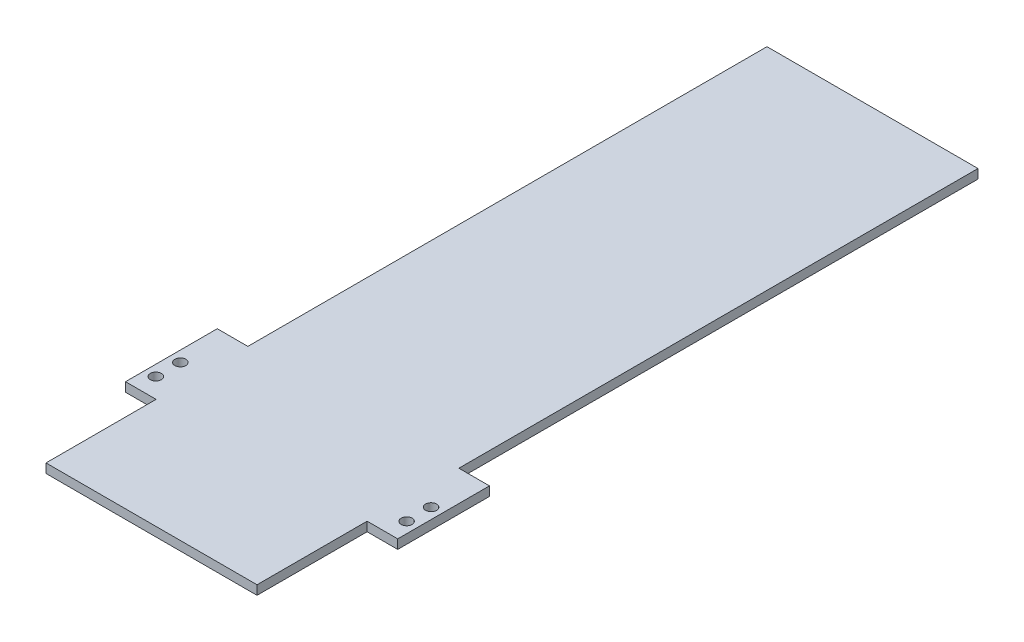
ISO-10303-21;
HEADER;
FILE_DESCRIPTION(('STEP AP214'),'2;1');
FILE_NAME('part.step','',(''),(''),'','','');
FILE_SCHEMA(('AUTOMOTIVE_DESIGN { 1 0 10303 214 1 1 1 1 }'));
ENDSEC;
DATA;
#1=APPLICATION_CONTEXT('core data for automotive mechanical design processes');
#2=APPLICATION_PROTOCOL_DEFINITION('international standard','automotive_design',2000,#1);
#3=PRODUCT_CONTEXT('',#1,'mechanical');
#4=PRODUCT('Part','Part','',(#3));
#5=PRODUCT_RELATED_PRODUCT_CATEGORY('part','',(#4));
#6=PRODUCT_DEFINITION_FORMATION('','',#4);
#7=PRODUCT_DEFINITION_CONTEXT('part definition',#1,'design');
#8=PRODUCT_DEFINITION('design','',#6,#7);
#9=PRODUCT_DEFINITION_SHAPE('','',#8);
#10=(LENGTH_UNIT() NAMED_UNIT(*) SI_UNIT(.MILLI.,.METRE.));
#11=(NAMED_UNIT(*) PLANE_ANGLE_UNIT() SI_UNIT($,.RADIAN.));
#12=(NAMED_UNIT(*) SI_UNIT($,.STERADIAN.) SOLID_ANGLE_UNIT());
#13=UNCERTAINTY_MEASURE_WITH_UNIT(LENGTH_MEASURE(1.E-05),#10,'distance_accuracy_value','');
#14=(GEOMETRIC_REPRESENTATION_CONTEXT(3) GLOBAL_UNCERTAINTY_ASSIGNED_CONTEXT((#13)) GLOBAL_UNIT_ASSIGNED_CONTEXT((#10,
#11,#12)) REPRESENTATION_CONTEXT('',''));
#15=CARTESIAN_POINT('',(0.,0.,0.));
#16=DIRECTION('',(0.,0.,1.));
#17=DIRECTION('',(1.,0.,0.));
#18=AXIS2_PLACEMENT_3D('',#15,#16,#17);
#19=CARTESIAN_POINT('',(0.,3.,-36.));
#20=DIRECTION('',(0.,0.,1.));
#21=DIRECTION('',(1.,0.,0.));
#22=AXIS2_PLACEMENT_3D('',#19,#20,#21);
#23=PLANE('',#22);
#24=DIRECTION('',(-1.,0.,0.));
#25=VECTOR('',#24,1.);
#26=CARTESIAN_POINT('',(0.,0.,-36.));
#27=LINE('',#26,#25);
#28=CARTESIAN_POINT('',(0.,0.,-36.));
#29=VERTEX_POINT('',#28);
#30=CARTESIAN_POINT('',(-9.99999999999999,0.,-36.));
#31=VERTEX_POINT('',#30);
#32=EDGE_CURVE('E170',#29,#31,#27,.T.);
#33=ORIENTED_EDGE('',*,*,#32,.F.);
#34=DIRECTION('',(0.,-1.,0.));
#35=VECTOR('',#34,1.);
#36=CARTESIAN_POINT('',(0.,3.,-36.));
#37=LINE('',#36,#35);
#38=CARTESIAN_POINT('',(0.,3.,-36.));
#39=VERTEX_POINT('',#38);
#40=EDGE_CURVE('E11',#39,#29,#37,.T.);
#41=ORIENTED_EDGE('',*,*,#40,.F.);
#42=DIRECTION('',(-1.,0.,0.));
#43=VECTOR('',#42,1.);
#44=CARTESIAN_POINT('',(0.,3.,-36.));
#45=LINE('',#44,#43);
#46=CARTESIAN_POINT('',(-9.99999999999999,3.,-36.));
#47=VERTEX_POINT('',#46);
#48=EDGE_CURVE('E205',#39,#47,#45,.T.);
#49=ORIENTED_EDGE('',*,*,#48,.T.);
#50=DIRECTION('',(0.,-1.,0.));
#51=VECTOR('',#50,1.);
#52=CARTESIAN_POINT('',(-9.99999999999999,3.,-36.));
#53=LINE('',#52,#51);
#54=EDGE_CURVE('E64',#47,#31,#53,.T.);
#55=ORIENTED_EDGE('',*,*,#54,.T.);
#56=EDGE_LOOP('',(#33,#41,#49,#55));
#57=FACE_BOUND('',#56,.T.);
#58=ADVANCED_FACE('F47',(#57),#23,.T.);
#59=CARTESIAN_POINT('',(0.,3.,0.));
#60=DIRECTION('',(-1.,0.,0.));
#61=DIRECTION('',(0.,0.,1.));
#62=AXIS2_PLACEMENT_3D('',#59,#60,#61);
#63=PLANE('',#62);
#64=DIRECTION('',(0.,0.,-1.));
#65=VECTOR('',#64,1.);
#66=CARTESIAN_POINT('',(0.,0.,0.));
#67=LINE('',#66,#65);
#68=CARTESIAN_POINT('',(0.,0.,0.));
#69=VERTEX_POINT('',#68);
#70=EDGE_CURVE('E173',#69,#29,#67,.T.);
#71=ORIENTED_EDGE('',*,*,#70,.F.);
#72=DIRECTION('',(0.,-1.,0.));
#73=VECTOR('',#72,1.);
#74=CARTESIAN_POINT('',(0.,3.,0.));
#75=LINE('',#74,#73);
#76=CARTESIAN_POINT('',(0.,3.,0.));
#77=VERTEX_POINT('',#76);
#78=EDGE_CURVE('E56',#77,#69,#75,.T.);
#79=ORIENTED_EDGE('',*,*,#78,.F.);
#80=DIRECTION('',(0.,0.,-1.));
#81=VECTOR('',#80,1.);
#82=CARTESIAN_POINT('',(0.,3.,0.));
#83=LINE('',#82,#81);
#84=EDGE_CURVE('E160',#77,#39,#83,.T.);
#85=ORIENTED_EDGE('',*,*,#84,.T.);
#86=ORIENTED_EDGE('',*,*,#40,.T.);
#87=EDGE_LOOP('',(#71,#79,#85,#86));
#88=FACE_BOUND('',#87,.T.);
#89=ADVANCED_FACE('F249',(#88),#63,.T.);
#90=CARTESIAN_POINT('',(0.,3.,0.));
#91=DIRECTION('',(0.,0.,-1.));
#92=DIRECTION('',(-1.,0.,0.));
#93=AXIS2_PLACEMENT_3D('',#90,#91,#92);
#94=PLANE('',#93);
#95=DIRECTION('',(1.,0.,0.));
#96=VECTOR('',#95,1.);
#97=CARTESIAN_POINT('',(0.,0.,0.));
#98=LINE('',#97,#96);
#99=CARTESIAN_POINT('',(69.,0.,0.));
#100=VERTEX_POINT('',#99);
#101=EDGE_CURVE('E178',#69,#100,#98,.T.);
#102=ORIENTED_EDGE('',*,*,#101,.T.);
#103=DIRECTION('',(0.,-1.,0.));
#104=VECTOR('',#103,1.);
#105=CARTESIAN_POINT('',(69.,3.,0.));
#106=LINE('',#105,#104);
#107=CARTESIAN_POINT('',(69.,3.,0.));
#108=VERTEX_POINT('',#107);
#109=EDGE_CURVE('E231',#108,#100,#106,.T.);
#110=ORIENTED_EDGE('',*,*,#109,.F.);
#111=DIRECTION('',(1.,0.,0.));
#112=VECTOR('',#111,1.);
#113=CARTESIAN_POINT('',(0.,3.,0.));
#114=LINE('',#113,#112);
#115=EDGE_CURVE('E240',#77,#108,#114,.T.);
#116=ORIENTED_EDGE('',*,*,#115,.F.);
#117=ORIENTED_EDGE('',*,*,#78,.T.);
#118=EDGE_LOOP('',(#102,#110,#116,#117));
#119=FACE_BOUND('',#118,.T.);
#120=ADVANCED_FACE('F238',(#119),#94,.F.);
#121=CARTESIAN_POINT('',(69.,3.,0.));
#122=DIRECTION('',(-1.,0.,0.));
#123=DIRECTION('',(0.,0.,1.));
#124=AXIS2_PLACEMENT_3D('',#121,#122,#123);
#125=PLANE('',#124);
#126=DIRECTION('',(0.,0.,-1.));
#127=VECTOR('',#126,1.);
#128=CARTESIAN_POINT('',(69.,0.,0.));
#129=LINE('',#128,#127);
#130=CARTESIAN_POINT('',(69.,0.,-36.));
#131=VERTEX_POINT('',#130);
#132=EDGE_CURVE('E181',#100,#131,#129,.T.);
#133=ORIENTED_EDGE('',*,*,#132,.T.);
#134=DIRECTION('',(0.,-1.,0.));
#135=VECTOR('',#134,1.);
#136=CARTESIAN_POINT('',(69.,3.,-36.));
#137=LINE('',#136,#135);
#138=CARTESIAN_POINT('',(69.,3.,-36.));
#139=VERTEX_POINT('',#138);
#140=EDGE_CURVE('E227',#139,#131,#137,.T.);
#141=ORIENTED_EDGE('',*,*,#140,.F.);
#142=DIRECTION('',(0.,0.,-1.));
#143=VECTOR('',#142,1.);
#144=CARTESIAN_POINT('',(69.,3.,0.));
#145=LINE('',#144,#143);
#146=EDGE_CURVE('E319',#108,#139,#145,.T.);
#147=ORIENTED_EDGE('',*,*,#146,.F.);
#148=ORIENTED_EDGE('',*,*,#109,.T.);
#149=EDGE_LOOP('',(#133,#141,#147,#148));
#150=FACE_BOUND('',#149,.T.);
#151=ADVANCED_FACE('F270',(#150),#125,.F.);
#152=CARTESIAN_POINT('',(0.,3.,-36.));
#153=DIRECTION('',(0.,0.,-1.));
#154=DIRECTION('',(-1.,0.,0.));
#155=AXIS2_PLACEMENT_3D('',#152,#153,#154);
#156=PLANE('',#155);
#157=DIRECTION('',(1.,0.,0.));
#158=VECTOR('',#157,1.);
#159=CARTESIAN_POINT('',(0.,0.,-36.));
#160=LINE('',#159,#158);
#161=CARTESIAN_POINT('',(79.,0.,-36.));
#162=VERTEX_POINT('',#161);
#163=EDGE_CURVE('E184',#131,#162,#160,.T.);
#164=ORIENTED_EDGE('',*,*,#163,.T.);
#165=DIRECTION('',(0.,-1.,0.));
#166=VECTOR('',#165,1.);
#167=CARTESIAN_POINT('',(79.,3.,-36.));
#168=LINE('',#167,#166);
#169=CARTESIAN_POINT('',(79.,3.,-36.));
#170=VERTEX_POINT('',#169);
#171=EDGE_CURVE('E223',#170,#162,#168,.T.);
#172=ORIENTED_EDGE('',*,*,#171,.F.);
#173=DIRECTION('',(1.,0.,0.));
#174=VECTOR('',#173,1.);
#175=CARTESIAN_POINT('',(0.,3.,-36.));
#176=LINE('',#175,#174);
#177=EDGE_CURVE('E325',#139,#170,#176,.T.);
#178=ORIENTED_EDGE('',*,*,#177,.F.);
#179=ORIENTED_EDGE('',*,*,#140,.T.);
#180=EDGE_LOOP('',(#164,#172,#178,#179));
#181=FACE_BOUND('',#180,.T.);
#182=ADVANCED_FACE('F293',(#181),#156,.F.);
#183=CARTESIAN_POINT('',(79.,3.,0.));
#184=DIRECTION('',(-1.,0.,0.));
#185=DIRECTION('',(0.,0.,1.));
#186=AXIS2_PLACEMENT_3D('',#183,#184,#185);
#187=PLANE('',#186);
#188=DIRECTION('',(0.,0.,-1.));
#189=VECTOR('',#188,1.);
#190=CARTESIAN_POINT('',(79.,0.,0.));
#191=LINE('',#190,#189);
#192=CARTESIAN_POINT('',(79.,0.,-66.));
#193=VERTEX_POINT('',#192);
#194=EDGE_CURVE('E188',#162,#193,#191,.T.);
#195=ORIENTED_EDGE('',*,*,#194,.T.);
#196=DIRECTION('',(0.,-1.,0.));
#197=VECTOR('',#196,1.);
#198=CARTESIAN_POINT('',(79.,3.,-66.));
#199=LINE('',#198,#197);
#200=CARTESIAN_POINT('',(79.,3.,-66.));
#201=VERTEX_POINT('',#200);
#202=EDGE_CURVE('E219',#201,#193,#199,.T.);
#203=ORIENTED_EDGE('',*,*,#202,.F.);
#204=DIRECTION('',(0.,0.,-1.));
#205=VECTOR('',#204,1.);
#206=CARTESIAN_POINT('',(79.,3.,0.));
#207=LINE('',#206,#205);
#208=EDGE_CURVE('E307',#170,#201,#207,.T.);
#209=ORIENTED_EDGE('',*,*,#208,.F.);
#210=ORIENTED_EDGE('',*,*,#171,.T.);
#211=EDGE_LOOP('',(#195,#203,#209,#210));
#212=FACE_BOUND('',#211,.T.);
#213=ADVANCED_FACE('F289',(#212),#187,.F.);
#214=CARTESIAN_POINT('',(0.,3.,-66.));
#215=DIRECTION('',(0.,0.,1.));
#216=DIRECTION('',(1.,0.,0.));
#217=AXIS2_PLACEMENT_3D('',#214,#215,#216);
#218=PLANE('',#217);
#219=DIRECTION('',(-1.,0.,0.));
#220=VECTOR('',#219,1.);
#221=CARTESIAN_POINT('',(0.,0.,-66.));
#222=LINE('',#221,#220);
#223=CARTESIAN_POINT('',(69.,0.,-66.));
#224=VERTEX_POINT('',#223);
#225=EDGE_CURVE('E191',#193,#224,#222,.T.);
#226=ORIENTED_EDGE('',*,*,#225,.T.);
#227=DIRECTION('',(0.,-1.,0.));
#228=VECTOR('',#227,1.);
#229=CARTESIAN_POINT('',(69.,3.,-66.));
#230=LINE('',#229,#228);
#231=CARTESIAN_POINT('',(69.,3.,-66.));
#232=VERTEX_POINT('',#231);
#233=EDGE_CURVE('E215',#232,#224,#230,.T.);
#234=ORIENTED_EDGE('',*,*,#233,.F.);
#235=DIRECTION('',(-1.,0.,0.));
#236=VECTOR('',#235,1.);
#237=CARTESIAN_POINT('',(0.,3.,-66.));
#238=LINE('',#237,#236);
#239=EDGE_CURVE('E317',#201,#232,#238,.T.);
#240=ORIENTED_EDGE('',*,*,#239,.F.);
#241=ORIENTED_EDGE('',*,*,#202,.T.);
#242=EDGE_LOOP('',(#226,#234,#240,#241));
#243=FACE_BOUND('',#242,.T.);
#244=ADVANCED_FACE('F282',(#243),#218,.F.);
#245=CARTESIAN_POINT('',(69.,0.,-235.74));
#246=VERTEX_POINT('',#245);
#247=EDGE_CURVE('E185',#224,#246,#129,.T.);
#248=ORIENTED_EDGE('',*,*,#247,.T.);
#249=DIRECTION('',(0.,-1.,0.));
#250=VECTOR('',#249,1.);
#251=CARTESIAN_POINT('',(69.,3.,-235.74));
#252=LINE('',#251,#250);
#253=CARTESIAN_POINT('',(69.,3.,-235.74));
#254=VERTEX_POINT('',#253);
#255=EDGE_CURVE('E212',#254,#246,#252,.T.);
#256=ORIENTED_EDGE('',*,*,#255,.F.);
#257=EDGE_CURVE('E315',#232,#254,#145,.T.);
#258=ORIENTED_EDGE('',*,*,#257,.F.);
#259=ORIENTED_EDGE('',*,*,#233,.T.);
#260=EDGE_LOOP('',(#248,#256,#258,#259));
#261=FACE_BOUND('',#260,.T.);
#262=ADVANCED_FACE('F277',(#261),#125,.F.);
#263=CARTESIAN_POINT('',(0.,3.,-235.74));
#264=DIRECTION('',(0.,0.,-1.));
#265=DIRECTION('',(-1.,0.,0.));
#266=AXIS2_PLACEMENT_3D('',#263,#264,#265);
#267=PLANE('',#266);
#268=DIRECTION('',(1.,0.,0.));
#269=VECTOR('',#268,1.);
#270=CARTESIAN_POINT('',(0.,0.,-235.74));
#271=LINE('',#270,#269);
#272=CARTESIAN_POINT('',(0.,0.,-235.74));
#273=VERTEX_POINT('',#272);
#274=EDGE_CURVE('E194',#273,#246,#271,.T.);
#275=ORIENTED_EDGE('',*,*,#274,.F.);
#276=DIRECTION('',(0.,-1.,0.));
#277=VECTOR('',#276,1.);
#278=CARTESIAN_POINT('',(0.,3.,-235.74));
#279=LINE('',#278,#277);
#280=CARTESIAN_POINT('',(0.,3.,-235.74));
#281=VERTEX_POINT('',#280);
#282=EDGE_CURVE('E148',#281,#273,#279,.T.);
#283=ORIENTED_EDGE('',*,*,#282,.F.);
#284=DIRECTION('',(1.,0.,0.));
#285=VECTOR('',#284,1.);
#286=CARTESIAN_POINT('',(0.,3.,-235.74));
#287=LINE('',#286,#285);
#288=EDGE_CURVE('E157',#281,#254,#287,.T.);
#289=ORIENTED_EDGE('',*,*,#288,.T.);
#290=ORIENTED_EDGE('',*,*,#255,.T.);
#291=EDGE_LOOP('',(#275,#283,#289,#290));
#292=FACE_BOUND('',#291,.T.);
#293=ADVANCED_FACE('F273',(#292),#267,.T.);
#294=CARTESIAN_POINT('',(0.,0.,-66.));
#295=VERTEX_POINT('',#294);
#296=EDGE_CURVE('E143',#295,#273,#67,.T.);
#297=ORIENTED_EDGE('',*,*,#296,.F.);
#298=DIRECTION('',(0.,-1.,0.));
#299=VECTOR('',#298,1.);
#300=CARTESIAN_POINT('',(0.,3.,-66.));
#301=LINE('',#300,#299);
#302=CARTESIAN_POINT('',(0.,3.,-66.));
#303=VERTEX_POINT('',#302);
#304=EDGE_CURVE('E138',#303,#295,#301,.T.);
#305=ORIENTED_EDGE('',*,*,#304,.F.);
#306=EDGE_CURVE('E141',#303,#281,#83,.T.);
#307=ORIENTED_EDGE('',*,*,#306,.T.);
#308=ORIENTED_EDGE('',*,*,#282,.T.);
#309=EDGE_LOOP('',(#297,#305,#307,#308));
#310=FACE_BOUND('',#309,.T.);
#311=ADVANCED_FACE('F140',(#310),#63,.T.);
#312=CARTESIAN_POINT('',(0.,3.,-66.));
#313=DIRECTION('',(0.,0.,-1.));
#314=DIRECTION('',(-1.,0.,0.));
#315=AXIS2_PLACEMENT_3D('',#312,#313,#314);
#316=PLANE('',#315);
#317=DIRECTION('',(1.,0.,0.));
#318=VECTOR('',#317,1.);
#319=CARTESIAN_POINT('',(0.,0.,-66.));
#320=LINE('',#319,#318);
#321=CARTESIAN_POINT('',(-10.,0.,-66.));
#322=VERTEX_POINT('',#321);
#323=EDGE_CURVE('E198',#322,#295,#320,.T.);
#324=ORIENTED_EDGE('',*,*,#323,.F.);
#325=DIRECTION('',(0.,-1.,0.));
#326=VECTOR('',#325,1.);
#327=CARTESIAN_POINT('',(-10.,3.,-66.));
#328=LINE('',#327,#326);
#329=CARTESIAN_POINT('',(-10.,3.,-66.));
#330=VERTEX_POINT('',#329);
#331=EDGE_CURVE('E101',#330,#322,#328,.T.);
#332=ORIENTED_EDGE('',*,*,#331,.F.);
#333=DIRECTION('',(1.,0.,0.));
#334=VECTOR('',#333,1.);
#335=CARTESIAN_POINT('',(0.,3.,-66.));
#336=LINE('',#335,#334);
#337=EDGE_CURVE('E155',#330,#303,#336,.T.);
#338=ORIENTED_EDGE('',*,*,#337,.T.);
#339=ORIENTED_EDGE('',*,*,#304,.T.);
#340=EDGE_LOOP('',(#324,#332,#338,#339));
#341=FACE_BOUND('',#340,.T.);
#342=ADVANCED_FACE('F161',(#341),#316,.T.);
#343=CARTESIAN_POINT('',(-9.99999999999998,3.,0.));
#344=DIRECTION('',(-1.,0.,0.));
#345=DIRECTION('',(0.,0.,1.));
#346=AXIS2_PLACEMENT_3D('',#343,#344,#345);
#347=PLANE('',#346);
#348=DIRECTION('',(0.,0.,-1.));
#349=VECTOR('',#348,1.);
#350=CARTESIAN_POINT('',(-9.99999999999998,0.,0.));
#351=LINE('',#350,#349);
#352=EDGE_CURVE('E201',#31,#322,#351,.T.);
#353=ORIENTED_EDGE('',*,*,#352,.F.);
#354=ORIENTED_EDGE('',*,*,#54,.F.);
#355=DIRECTION('',(0.,0.,-1.));
#356=VECTOR('',#355,1.);
#357=CARTESIAN_POINT('',(-9.99999999999998,3.,0.));
#358=LINE('',#357,#356);
#359=EDGE_CURVE('E163',#47,#330,#358,.T.);
#360=ORIENTED_EDGE('',*,*,#359,.T.);
#361=ORIENTED_EDGE('',*,*,#331,.T.);
#362=EDGE_LOOP('',(#353,#354,#360,#361));
#363=FACE_BOUND('',#362,.T.);
#364=ADVANCED_FACE('F250',(#363),#347,.T.);
#365=CARTESIAN_POINT('',(0.,3.,0.));
#366=DIRECTION('',(0.,1.,0.));
#367=DIRECTION('',(0.,0.,1.));
#368=AXIS2_PLACEMENT_3D('',#365,#366,#367);
#369=PLANE('',#368);
#370=CARTESIAN_POINT('',(-6.49999999999996,3.,-50.4206355490729));
#371=DIRECTION('',(0.,1.,0.));
#372=DIRECTION('',(0.,0.,1.));
#373=AXIS2_PLACEMENT_3D('',#370,#371,#372);
#374=CIRCLE('',#373,1.79999999999999);
#375=CARTESIAN_POINT('',(-6.49999999999996,3.,-48.6206355490729));
#376=VERTEX_POINT('',#375);
#377=EDGE_CURVE('E360',#376,#376,#374,.T.);
#378=ORIENTED_EDGE('',*,*,#377,.F.);
#379=EDGE_LOOP('',(#378));
#380=FACE_BOUND('',#379,.T.);
#381=CARTESIAN_POINT('',(-6.49999999999996,3.,-42.4206355490729));
#382=DIRECTION('',(0.,1.,0.));
#383=DIRECTION('',(0.,0.,1.));
#384=AXIS2_PLACEMENT_3D('',#381,#382,#383);
#385=CIRCLE('',#384,1.79999999999999);
#386=CARTESIAN_POINT('',(-6.49999999999996,3.,-40.6206355490729));
#387=VERTEX_POINT('',#386);
#388=EDGE_CURVE('E352',#387,#387,#385,.T.);
#389=ORIENTED_EDGE('',*,*,#388,.F.);
#390=EDGE_LOOP('',(#389));
#391=FACE_BOUND('',#390,.T.);
#392=CARTESIAN_POINT('',(75.5,3.,-50.4206355490729));
#393=DIRECTION('',(0.,1.,0.));
#394=DIRECTION('',(0.,0.,1.));
#395=AXIS2_PLACEMENT_3D('',#392,#393,#394);
#396=CIRCLE('',#395,1.79999999999998);
#397=CARTESIAN_POINT('',(75.5,3.,-48.6206355490729));
#398=VERTEX_POINT('',#397);
#399=EDGE_CURVE('E344',#398,#398,#396,.T.);
#400=ORIENTED_EDGE('',*,*,#399,.F.);
#401=EDGE_LOOP('',(#400));
#402=FACE_BOUND('',#401,.T.);
#403=CARTESIAN_POINT('',(75.5,3.,-42.4206355490729));
#404=DIRECTION('',(0.,1.,0.));
#405=DIRECTION('',(0.,0.,1.));
#406=AXIS2_PLACEMENT_3D('',#403,#404,#405);
#407=CIRCLE('',#406,1.79999999999998);
#408=CARTESIAN_POINT('',(75.5,3.,-40.6206355490729));
#409=VERTEX_POINT('',#408);
#410=EDGE_CURVE('E336',#409,#409,#407,.T.);
#411=ORIENTED_EDGE('',*,*,#410,.F.);
#412=EDGE_LOOP('',(#411));
#413=FACE_BOUND('',#412,.T.);
#414=ORIENTED_EDGE('',*,*,#48,.F.);
#415=ORIENTED_EDGE('',*,*,#84,.F.);
#416=ORIENTED_EDGE('',*,*,#115,.T.);
#417=ORIENTED_EDGE('',*,*,#146,.T.);
#418=ORIENTED_EDGE('',*,*,#177,.T.);
#419=ORIENTED_EDGE('',*,*,#208,.T.);
#420=ORIENTED_EDGE('',*,*,#239,.T.);
#421=ORIENTED_EDGE('',*,*,#257,.T.);
#422=ORIENTED_EDGE('',*,*,#288,.F.);
#423=ORIENTED_EDGE('',*,*,#306,.F.);
#424=ORIENTED_EDGE('',*,*,#337,.F.);
#425=ORIENTED_EDGE('',*,*,#359,.F.);
#426=EDGE_LOOP('',(#414,#415,#416,#417,#418,#419,#420,#421,#422,#423,#424,#425));
#427=FACE_BOUND('',#426,.T.);
#428=ADVANCED_FACE('F153',(#380,#391,#402,#413,#427),#369,.T.);
#429=CARTESIAN_POINT('',(0.,0.,0.));
#430=DIRECTION('',(0.,1.,0.));
#431=DIRECTION('',(0.,0.,1.));
#432=AXIS2_PLACEMENT_3D('',#429,#430,#431);
#433=PLANE('',#432);
#434=CARTESIAN_POINT('',(-6.49999999999996,0.,-50.4206355490729));
#435=DIRECTION('',(0.,1.,0.));
#436=DIRECTION('',(0.,0.,1.));
#437=AXIS2_PLACEMENT_3D('',#434,#435,#436);
#438=CIRCLE('',#437,1.79999999999999);
#439=CARTESIAN_POINT('',(-6.49999999999996,0.,-48.6206355490729));
#440=VERTEX_POINT('',#439);
#441=EDGE_CURVE('E356',#440,#440,#438,.T.);
#442=ORIENTED_EDGE('',*,*,#441,.T.);
#443=EDGE_LOOP('',(#442));
#444=FACE_BOUND('',#443,.T.);
#445=CARTESIAN_POINT('',(-6.49999999999996,0.,-42.4206355490729));
#446=DIRECTION('',(0.,1.,0.));
#447=DIRECTION('',(0.,0.,1.));
#448=AXIS2_PLACEMENT_3D('',#445,#446,#447);
#449=CIRCLE('',#448,1.79999999999999);
#450=CARTESIAN_POINT('',(-6.49999999999996,0.,-40.6206355490729));
#451=VERTEX_POINT('',#450);
#452=EDGE_CURVE('E348',#451,#451,#449,.T.);
#453=ORIENTED_EDGE('',*,*,#452,.T.);
#454=EDGE_LOOP('',(#453));
#455=FACE_BOUND('',#454,.T.);
#456=CARTESIAN_POINT('',(75.5,0.,-50.4206355490729));
#457=DIRECTION('',(0.,1.,0.));
#458=DIRECTION('',(0.,0.,1.));
#459=AXIS2_PLACEMENT_3D('',#456,#457,#458);
#460=CIRCLE('',#459,1.8);
#461=CARTESIAN_POINT('',(75.5,0.,-48.6206355490729));
#462=VERTEX_POINT('',#461);
#463=EDGE_CURVE('E340',#462,#462,#460,.T.);
#464=ORIENTED_EDGE('',*,*,#463,.T.);
#465=EDGE_LOOP('',(#464));
#466=FACE_BOUND('',#465,.T.);
#467=CARTESIAN_POINT('',(75.5,0.,-42.4206355490729));
#468=DIRECTION('',(0.,1.,0.));
#469=DIRECTION('',(0.,0.,1.));
#470=AXIS2_PLACEMENT_3D('',#467,#468,#469);
#471=CIRCLE('',#470,1.8);
#472=CARTESIAN_POINT('',(75.5,0.,-40.6206355490729));
#473=VERTEX_POINT('',#472);
#474=EDGE_CURVE('E174',#473,#473,#471,.T.);
#475=ORIENTED_EDGE('',*,*,#474,.T.);
#476=EDGE_LOOP('',(#475));
#477=FACE_BOUND('',#476,.T.);
#478=ORIENTED_EDGE('',*,*,#32,.T.);
#479=ORIENTED_EDGE('',*,*,#352,.T.);
#480=ORIENTED_EDGE('',*,*,#323,.T.);
#481=ORIENTED_EDGE('',*,*,#296,.T.);
#482=ORIENTED_EDGE('',*,*,#274,.T.);
#483=ORIENTED_EDGE('',*,*,#247,.F.);
#484=ORIENTED_EDGE('',*,*,#225,.F.);
#485=ORIENTED_EDGE('',*,*,#194,.F.);
#486=ORIENTED_EDGE('',*,*,#163,.F.);
#487=ORIENTED_EDGE('',*,*,#132,.F.);
#488=ORIENTED_EDGE('',*,*,#101,.F.);
#489=ORIENTED_EDGE('',*,*,#70,.T.);
#490=EDGE_LOOP('',(#478,#479,#480,#481,#482,#483,#484,#485,#486,#487,#488,#489));
#491=FACE_BOUND('',#490,.T.);
#492=ADVANCED_FACE('F247',(#444,#455,#466,#477,#491),#433,.F.);
#493=CARTESIAN_POINT('',(75.5,3.,-42.4206355490729));
#494=DIRECTION('',(0.,1.,0.));
#495=DIRECTION('',(0.,0.,1.));
#496=AXIS2_PLACEMENT_3D('',#493,#494,#495);
#497=CYLINDRICAL_SURFACE('',#496,1.79999999999999);
#498=ORIENTED_EDGE('',*,*,#474,.F.);
#499=EDGE_LOOP('',(#498));
#500=FACE_BOUND('',#499,.T.);
#501=ORIENTED_EDGE('',*,*,#410,.T.);
#502=EDGE_LOOP('',(#501));
#503=FACE_BOUND('',#502,.T.);
#504=ADVANCED_FACE('F373',(#500,#503),#497,.F.);
#505=CARTESIAN_POINT('',(75.5,3.,-50.4206355490729));
#506=DIRECTION('',(0.,1.,0.));
#507=DIRECTION('',(0.,0.,1.));
#508=AXIS2_PLACEMENT_3D('',#505,#506,#507);
#509=CYLINDRICAL_SURFACE('',#508,1.79999999999999);
#510=ORIENTED_EDGE('',*,*,#463,.F.);
#511=EDGE_LOOP('',(#510));
#512=FACE_BOUND('',#511,.T.);
#513=ORIENTED_EDGE('',*,*,#399,.T.);
#514=EDGE_LOOP('',(#513));
#515=FACE_BOUND('',#514,.T.);
#516=ADVANCED_FACE('F374',(#512,#515),#509,.F.);
#517=CARTESIAN_POINT('',(-6.49999999999996,3.,-42.4206355490729));
#518=DIRECTION('',(0.,1.,0.));
#519=DIRECTION('',(0.,0.,1.));
#520=AXIS2_PLACEMENT_3D('',#517,#518,#519);
#521=CYLINDRICAL_SURFACE('',#520,1.79999999999999);
#522=ORIENTED_EDGE('',*,*,#452,.F.);
#523=EDGE_LOOP('',(#522));
#524=FACE_BOUND('',#523,.T.);
#525=ORIENTED_EDGE('',*,*,#388,.T.);
#526=EDGE_LOOP('',(#525));
#527=FACE_BOUND('',#526,.T.);
#528=ADVANCED_FACE('F380',(#524,#527),#521,.F.);
#529=CARTESIAN_POINT('',(-6.49999999999996,3.,-50.4206355490729));
#530=DIRECTION('',(0.,1.,0.));
#531=DIRECTION('',(0.,0.,1.));
#532=AXIS2_PLACEMENT_3D('',#529,#530,#531);
#533=CYLINDRICAL_SURFACE('',#532,1.79999999999999);
#534=ORIENTED_EDGE('',*,*,#441,.F.);
#535=EDGE_LOOP('',(#534));
#536=FACE_BOUND('',#535,.T.);
#537=ORIENTED_EDGE('',*,*,#377,.T.);
#538=EDGE_LOOP('',(#537));
#539=FACE_BOUND('',#538,.T.);
#540=ADVANCED_FACE('F365',(#536,#539),#533,.F.);
#541=CLOSED_SHELL('',(#58,#89,#120,#151,#182,#213,#244,#262,#293,#311,#342,#364,#428,#492,#504,
#516,#528,#540));
#542=MANIFOLD_SOLID_BREP('B2',#541);
#543=ADVANCED_BREP_SHAPE_REPRESENTATION('',(#18,#542),#14);
#544=SHAPE_DEFINITION_REPRESENTATION(#9,#543);
ENDSEC;
END-ISO-10303-21;
